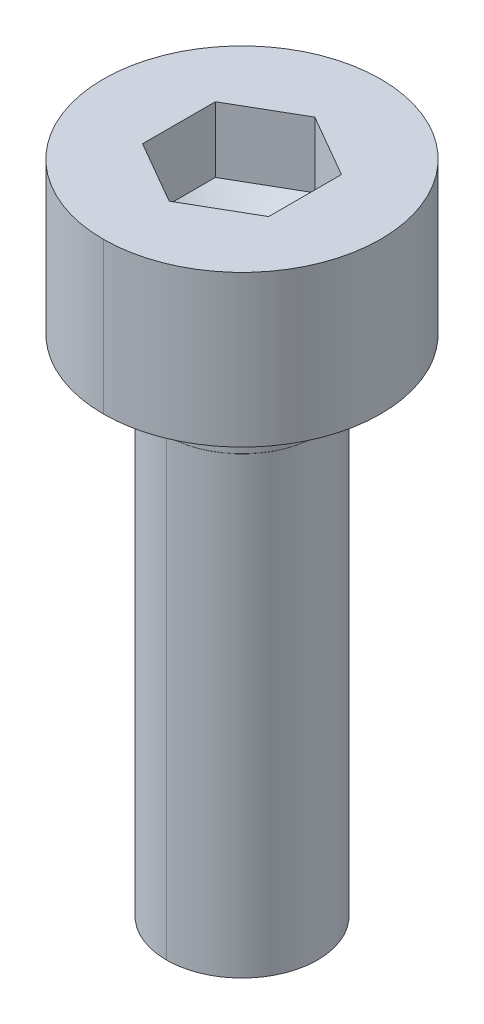
ISO-10303-21;
HEADER;
FILE_DESCRIPTION(('STEP AP214'),'2;1');
FILE_NAME('part.step','',(''),(''),'','','');
FILE_SCHEMA(('AUTOMOTIVE_DESIGN { 1 0 10303 214 1 1 1 1 }'));
ENDSEC;
DATA;
#1=APPLICATION_CONTEXT('core data for automotive mechanical design processes');
#2=APPLICATION_PROTOCOL_DEFINITION('international standard','automotive_design',2000,#1);
#3=PRODUCT_CONTEXT('',#1,'mechanical');
#4=PRODUCT('Part','Part','',(#3));
#5=PRODUCT_RELATED_PRODUCT_CATEGORY('part','',(#4));
#6=PRODUCT_DEFINITION_FORMATION('','',#4);
#7=PRODUCT_DEFINITION_CONTEXT('part definition',#1,'design');
#8=PRODUCT_DEFINITION('design','',#6,#7);
#9=PRODUCT_DEFINITION_SHAPE('','',#8);
#10=(LENGTH_UNIT() NAMED_UNIT(*) SI_UNIT(.MILLI.,.METRE.));
#11=(NAMED_UNIT(*) PLANE_ANGLE_UNIT() SI_UNIT($,.RADIAN.));
#12=(NAMED_UNIT(*) SI_UNIT($,.STERADIAN.) SOLID_ANGLE_UNIT());
#13=UNCERTAINTY_MEASURE_WITH_UNIT(LENGTH_MEASURE(1.E-05),#10,'distance_accuracy_value','');
#14=(GEOMETRIC_REPRESENTATION_CONTEXT(3) GLOBAL_UNCERTAINTY_ASSIGNED_CONTEXT((#13)) GLOBAL_UNIT_ASSIGNED_CONTEXT((#10,
#11,#12)) REPRESENTATION_CONTEXT('',''));
#15=CARTESIAN_POINT('',(0.,0.,0.));
#16=DIRECTION('',(0.,0.,1.));
#17=DIRECTION('',(1.,0.,0.));
#18=AXIS2_PLACEMENT_3D('',#15,#16,#17);
#19=CARTESIAN_POINT('',(32.0429399400243,1123.86666666666,18.5000000000011));
#20=DIRECTION('',(0.,1.,0.));
#21=DIRECTION('',(0.,0.,-1.));
#22=AXIS2_PLACEMENT_3D('',#19,#20,#21);
#23=CONICAL_SURFACE('',#22,1732.05080756898,1.04719755119662);
#24=DIRECTION('',(0.,0.499999999999978,0.866025403784451));
#25=VECTOR('',#24,1.);
#26=CARTESIAN_POINT('',(32.0429399400242,123.866666666664,18.5));
#27=LINE('',#26,#25);
#28=CARTESIAN_POINT('',(32.0429399400242,123.866666666664,18.5));
#29=VERTEX_POINT('',#28);
#30=CARTESIAN_POINT('',(32.0429399400241,124.699999999997,19.9433756729742));
#31=VERTEX_POINT('',#30);
#32=EDGE_CURVE('E136',#29,#31,#27,.T.);
#33=ORIENTED_EDGE('',*,*,#32,.F.);
#34=DIRECTION('',(0.,0.49999999999998,-0.86602540378445));
#35=VECTOR('',#34,1.);
#36=CARTESIAN_POINT('',(32.0429399400242,123.866666666664,18.5));
#37=LINE('',#36,#35);
#38=CARTESIAN_POINT('',(32.0429399400244,124.699999999997,17.0566243270259));
#39=VERTEX_POINT('',#38);
#40=EDGE_CURVE('E138',#29,#39,#37,.T.);
#41=ORIENTED_EDGE('',*,*,#40,.T.);
#42=CARTESIAN_POINT('',(32.0429399400242,124.699999999997,18.5));
#43=DIRECTION('',(0.,1.,0.));
#44=DIRECTION('',(0.,0.,1.));
#45=AXIS2_PLACEMENT_3D('',#42,#43,#44);
#46=CIRCLE('',#45,1.44337567297414);
#47=CARTESIAN_POINT('',(30.7929399400243,124.699999999997,17.7783121635129));
#48=VERTEX_POINT('',#47);
#49=EDGE_CURVE('E11',#39,#48,#46,.T.);
#50=ORIENTED_EDGE('',*,*,#49,.T.);
#51=CARTESIAN_POINT('',(32.0429399400242,124.699999999997,18.5));
#52=DIRECTION('',(0.,1.,0.));
#53=DIRECTION('',(0.,0.,1.));
#54=AXIS2_PLACEMENT_3D('',#51,#52,#53);
#55=CIRCLE('',#54,1.44337567297414);
#56=CARTESIAN_POINT('',(30.7929399400241,124.699999999997,19.221687836487));
#57=VERTEX_POINT('',#56);
#58=EDGE_CURVE('E25',#48,#57,#55,.T.);
#59=ORIENTED_EDGE('',*,*,#58,.T.);
#60=CARTESIAN_POINT('',(32.0429399400242,124.699999999997,18.5));
#61=DIRECTION('',(0.,1.,0.));
#62=DIRECTION('',(0.,0.,1.));
#63=AXIS2_PLACEMENT_3D('',#60,#61,#62);
#64=CIRCLE('',#63,1.44337567297414);
#65=EDGE_CURVE('E139',#57,#31,#64,.T.);
#66=ORIENTED_EDGE('',*,*,#65,.T.);
#67=EDGE_LOOP('',(#33,#41,#50,#59,#66));
#68=FACE_BOUND('',#67,.T.);
#69=ADVANCED_FACE('F17',(#68),#23,.F.);
#70=CARTESIAN_POINT('',(33.4863156129984,124.699999999997,18.5));
#71=DIRECTION('',(0.,1.,0.));
#72=DIRECTION('',(0.,0.,-1.));
#73=AXIS2_PLACEMENT_3D('',#70,#71,#72);
#74=PLANE('',#73);
#75=DIRECTION('',(0.,0.,1.));
#76=VECTOR('',#75,1.);
#77=CARTESIAN_POINT('',(33.2929399400242,124.699999999997,17.778312163513));
#78=LINE('',#77,#76);
#79=CARTESIAN_POINT('',(33.2929399400242,124.699999999997,17.778312163513));
#80=VERTEX_POINT('',#79);
#81=CARTESIAN_POINT('',(33.2929399400242,124.699999999997,19.2216878364873));
#82=VERTEX_POINT('',#81);
#83=EDGE_CURVE('E175',#80,#82,#78,.T.);
#84=ORIENTED_EDGE('',*,*,#83,.F.);
#85=CARTESIAN_POINT('',(32.0429399400242,124.699999999997,18.5));
#86=DIRECTION('',(0.,1.,0.));
#87=DIRECTION('',(0.,0.,1.));
#88=AXIS2_PLACEMENT_3D('',#85,#86,#87);
#89=CIRCLE('',#88,1.44337567297414);
#90=EDGE_CURVE('E172',#82,#80,#89,.T.);
#91=ORIENTED_EDGE('',*,*,#90,.F.);
#92=EDGE_LOOP('',(#84,#91));
#93=FACE_BOUND('',#92,.T.);
#94=ADVANCED_FACE('F317',(#93),#74,.F.);
#95=CARTESIAN_POINT('',(33.4863156129984,124.699999999997,18.5));
#96=DIRECTION('',(0.,1.,0.));
#97=DIRECTION('',(0.,0.,-1.));
#98=AXIS2_PLACEMENT_3D('',#95,#96,#97);
#99=PLANE('',#98);
#100=DIRECTION('',(0.866025403784439,0.,0.5));
#101=VECTOR('',#100,1.);
#102=CARTESIAN_POINT('',(32.0429399400242,124.699999999997,17.056624327026));
#103=LINE('',#102,#101);
#104=EDGE_CURVE('E295',#39,#80,#103,.T.);
#105=ORIENTED_EDGE('',*,*,#104,.F.);
#106=CARTESIAN_POINT('',(32.0429399400242,124.699999999997,18.5));
#107=DIRECTION('',(0.,1.,0.));
#108=DIRECTION('',(0.,0.,1.));
#109=AXIS2_PLACEMENT_3D('',#106,#107,#108);
#110=CIRCLE('',#109,1.44337567297414);
#111=EDGE_CURVE('E150',#80,#39,#110,.T.);
#112=ORIENTED_EDGE('',*,*,#111,.F.);
#113=EDGE_LOOP('',(#105,#112));
#114=FACE_BOUND('',#113,.T.);
#115=ADVANCED_FACE('F319',(#114),#99,.F.);
#116=CARTESIAN_POINT('',(33.4863156129984,124.699999999997,18.5));
#117=DIRECTION('',(0.,1.,0.));
#118=DIRECTION('',(0.,0.,-1.));
#119=AXIS2_PLACEMENT_3D('',#116,#117,#118);
#120=PLANE('',#119);
#121=DIRECTION('',(0.866025403784439,0.,-0.5));
#122=VECTOR('',#121,1.);
#123=CARTESIAN_POINT('',(30.7929399400243,124.699999999997,17.778312163513));
#124=LINE('',#123,#122);
#125=EDGE_CURVE('E287',#48,#39,#124,.T.);
#126=ORIENTED_EDGE('',*,*,#125,.F.);
#127=ORIENTED_EDGE('',*,*,#49,.F.);
#128=EDGE_LOOP('',(#126,#127));
#129=FACE_BOUND('',#128,.T.);
#130=ADVANCED_FACE('F326',(#129),#120,.F.);
#131=CARTESIAN_POINT('',(33.4863156129984,124.699999999997,18.5));
#132=DIRECTION('',(0.,1.,0.));
#133=DIRECTION('',(0.,0.,-1.));
#134=AXIS2_PLACEMENT_3D('',#131,#132,#133);
#135=PLANE('',#134);
#136=DIRECTION('',(0.,0.,-1.));
#137=VECTOR('',#136,1.);
#138=CARTESIAN_POINT('',(30.7929399400243,124.699999999997,19.221687836487));
#139=LINE('',#138,#137);
#140=EDGE_CURVE('E197',#57,#48,#139,.T.);
#141=ORIENTED_EDGE('',*,*,#140,.F.);
#142=ORIENTED_EDGE('',*,*,#58,.F.);
#143=EDGE_LOOP('',(#141,#142));
#144=FACE_BOUND('',#143,.T.);
#145=ADVANCED_FACE('F332',(#144),#135,.F.);
#146=CARTESIAN_POINT('',(33.4863156129984,124.699999999997,18.5));
#147=DIRECTION('',(0.,1.,0.));
#148=DIRECTION('',(0.,0.,-1.));
#149=AXIS2_PLACEMENT_3D('',#146,#147,#148);
#150=PLANE('',#149);
#151=DIRECTION('',(-0.866025403784439,0.,-0.5));
#152=VECTOR('',#151,1.);
#153=CARTESIAN_POINT('',(32.0429399400242,124.699999999997,19.9433756729741));
#154=LINE('',#153,#152);
#155=EDGE_CURVE('E218',#31,#57,#154,.T.);
#156=ORIENTED_EDGE('',*,*,#155,.F.);
#157=ORIENTED_EDGE('',*,*,#65,.F.);
#158=EDGE_LOOP('',(#156,#157));
#159=FACE_BOUND('',#158,.T.);
#160=ADVANCED_FACE('F336',(#159),#150,.F.);
#161=CARTESIAN_POINT('',(33.4863156129984,124.699999999997,18.5));
#162=DIRECTION('',(0.,1.,0.));
#163=DIRECTION('',(0.,0.,-1.));
#164=AXIS2_PLACEMENT_3D('',#161,#162,#163);
#165=PLANE('',#164);
#166=DIRECTION('',(-0.866025403784439,0.,0.5));
#167=VECTOR('',#166,1.);
#168=CARTESIAN_POINT('',(33.2929399400242,124.699999999997,19.221687836487));
#169=LINE('',#168,#167);
#170=EDGE_CURVE('E265',#82,#31,#169,.T.);
#171=ORIENTED_EDGE('',*,*,#170,.F.);
#172=CARTESIAN_POINT('',(32.0429399400242,124.699999999997,18.5));
#173=DIRECTION('',(0.,1.,0.));
#174=DIRECTION('',(0.,0.,1.));
#175=AXIS2_PLACEMENT_3D('',#172,#173,#174);
#176=CIRCLE('',#175,1.44337567297414);
#177=EDGE_CURVE('E144',#31,#82,#176,.T.);
#178=ORIENTED_EDGE('',*,*,#177,.F.);
#179=EDGE_LOOP('',(#171,#178));
#180=FACE_BOUND('',#179,.T.);
#181=ADVANCED_FACE('F316',(#180),#165,.F.);
#182=CARTESIAN_POINT('',(33.2929399400242,125.999999999997,17.778312163513));
#183=DIRECTION('',(-1.,0.,0.));
#184=DIRECTION('',(0.,0.,1.));
#185=AXIS2_PLACEMENT_3D('',#182,#183,#184);
#186=PLANE('',#185);
#187=ORIENTED_EDGE('',*,*,#83,.T.);
#188=DIRECTION('',(0.,-1.,0.));
#189=VECTOR('',#188,1.);
#190=CARTESIAN_POINT('',(33.2929399400242,125.999999999997,19.221687836487));
#191=LINE('',#190,#189);
#192=CARTESIAN_POINT('',(33.2929399400242,125.999999999997,19.221687836487));
#193=VERTEX_POINT('',#192);
#194=EDGE_CURVE('E222',#193,#82,#191,.T.);
#195=ORIENTED_EDGE('',*,*,#194,.F.);
#196=DIRECTION('',(0.,0.,1.));
#197=VECTOR('',#196,1.);
#198=CARTESIAN_POINT('',(33.2929399400242,125.999999999997,17.778312163513));
#199=LINE('',#198,#197);
#200=CARTESIAN_POINT('',(33.2929399400242,125.999999999997,17.778312163513));
#201=VERTEX_POINT('',#200);
#202=EDGE_CURVE('E254',#201,#193,#199,.T.);
#203=ORIENTED_EDGE('',*,*,#202,.F.);
#204=DIRECTION('',(0.,-1.,0.));
#205=VECTOR('',#204,1.);
#206=CARTESIAN_POINT('',(33.2929399400242,125.999999999997,17.778312163513));
#207=LINE('',#206,#205);
#208=EDGE_CURVE('E299',#201,#80,#207,.T.);
#209=ORIENTED_EDGE('',*,*,#208,.T.);
#210=EDGE_LOOP('',(#187,#195,#203,#209));
#211=FACE_BOUND('',#210,.T.);
#212=ADVANCED_FACE('F306',(#211),#186,.T.);
#213=CARTESIAN_POINT('',(32.0429399400242,125.999999999997,17.056624327026));
#214=DIRECTION('',(-0.5,0.,0.866025403784439));
#215=DIRECTION('',(0.,1.,0.));
#216=AXIS2_PLACEMENT_3D('',#213,#214,#215);
#217=PLANE('',#216);
#218=ORIENTED_EDGE('',*,*,#104,.T.);
#219=ORIENTED_EDGE('',*,*,#208,.F.);
#220=DIRECTION('',(0.866025403784439,0.,0.5));
#221=VECTOR('',#220,1.);
#222=CARTESIAN_POINT('',(32.0429399400242,125.999999999997,17.056624327026));
#223=LINE('',#222,#221);
#224=CARTESIAN_POINT('',(32.0429399400242,125.999999999997,17.056624327026));
#225=VERTEX_POINT('',#224);
#226=EDGE_CURVE('E250',#225,#201,#223,.T.);
#227=ORIENTED_EDGE('',*,*,#226,.F.);
#228=DIRECTION('',(0.,-1.,0.));
#229=VECTOR('',#228,1.);
#230=CARTESIAN_POINT('',(32.0429399400242,125.999999999997,17.056624327026));
#231=LINE('',#230,#229);
#232=EDGE_CURVE('E291',#225,#39,#231,.T.);
#233=ORIENTED_EDGE('',*,*,#232,.T.);
#234=EDGE_LOOP('',(#218,#219,#227,#233));
#235=FACE_BOUND('',#234,.T.);
#236=ADVANCED_FACE('F345',(#235),#217,.T.);
#237=CARTESIAN_POINT('',(30.7929399400243,125.999999999997,17.778312163513));
#238=DIRECTION('',(0.5,0.,0.866025403784439));
#239=DIRECTION('',(0.,-1.,0.));
#240=AXIS2_PLACEMENT_3D('',#237,#238,#239);
#241=PLANE('',#240);
#242=ORIENTED_EDGE('',*,*,#125,.T.);
#243=ORIENTED_EDGE('',*,*,#232,.F.);
#244=DIRECTION('',(0.866025403784439,0.,-0.5));
#245=VECTOR('',#244,1.);
#246=CARTESIAN_POINT('',(30.7929399400243,125.999999999997,17.778312163513));
#247=LINE('',#246,#245);
#248=CARTESIAN_POINT('',(30.7929399400243,125.999999999997,17.778312163513));
#249=VERTEX_POINT('',#248);
#250=EDGE_CURVE('E242',#249,#225,#247,.T.);
#251=ORIENTED_EDGE('',*,*,#250,.F.);
#252=DIRECTION('',(0.,-1.,0.));
#253=VECTOR('',#252,1.);
#254=CARTESIAN_POINT('',(30.7929399400243,125.999999999997,17.778312163513));
#255=LINE('',#254,#253);
#256=EDGE_CURVE('E201',#249,#48,#255,.T.);
#257=ORIENTED_EDGE('',*,*,#256,.T.);
#258=EDGE_LOOP('',(#242,#243,#251,#257));
#259=FACE_BOUND('',#258,.T.);
#260=ADVANCED_FACE('F350',(#259),#241,.T.);
#261=CARTESIAN_POINT('',(30.7929399400243,125.999999999997,19.221687836487));
#262=DIRECTION('',(1.,0.,0.));
#263=DIRECTION('',(0.,0.,1.));
#264=AXIS2_PLACEMENT_3D('',#261,#262,#263);
#265=PLANE('',#264);
#266=ORIENTED_EDGE('',*,*,#140,.T.);
#267=ORIENTED_EDGE('',*,*,#256,.F.);
#268=DIRECTION('',(0.,0.,-1.));
#269=VECTOR('',#268,1.);
#270=CARTESIAN_POINT('',(30.7929399400243,125.999999999997,19.221687836487));
#271=LINE('',#270,#269);
#272=CARTESIAN_POINT('',(30.7929399400243,125.999999999997,19.221687836487));
#273=VERTEX_POINT('',#272);
#274=EDGE_CURVE('E238',#273,#249,#271,.T.);
#275=ORIENTED_EDGE('',*,*,#274,.F.);
#276=DIRECTION('',(0.,-1.,0.));
#277=VECTOR('',#276,1.);
#278=CARTESIAN_POINT('',(30.7929399400243,125.999999999997,19.221687836487));
#279=LINE('',#278,#277);
#280=EDGE_CURVE('E202',#273,#57,#279,.T.);
#281=ORIENTED_EDGE('',*,*,#280,.T.);
#282=EDGE_LOOP('',(#266,#267,#275,#281));
#283=FACE_BOUND('',#282,.T.);
#284=ADVANCED_FACE('F346',(#283),#265,.T.);
#285=CARTESIAN_POINT('',(32.0429399400242,125.999999999997,19.9433756729741));
#286=DIRECTION('',(0.5,0.,-0.866025403784439));
#287=DIRECTION('',(0.,-1.,0.));
#288=AXIS2_PLACEMENT_3D('',#285,#286,#287);
#289=PLANE('',#288);
#290=ORIENTED_EDGE('',*,*,#155,.T.);
#291=ORIENTED_EDGE('',*,*,#280,.F.);
#292=DIRECTION('',(-0.866025403784439,0.,-0.5));
#293=VECTOR('',#292,1.);
#294=CARTESIAN_POINT('',(32.0429399400242,125.999999999997,19.9433756729741));
#295=LINE('',#294,#293);
#296=CARTESIAN_POINT('',(32.0429399400242,125.999999999997,19.9433756729741));
#297=VERTEX_POINT('',#296);
#298=EDGE_CURVE('E229',#297,#273,#295,.T.);
#299=ORIENTED_EDGE('',*,*,#298,.F.);
#300=DIRECTION('',(0.,-1.,0.));
#301=VECTOR('',#300,1.);
#302=CARTESIAN_POINT('',(32.0429399400242,125.999999999997,19.9433756729741));
#303=LINE('',#302,#301);
#304=EDGE_CURVE('E246',#297,#31,#303,.T.);
#305=ORIENTED_EDGE('',*,*,#304,.T.);
#306=EDGE_LOOP('',(#290,#291,#299,#305));
#307=FACE_BOUND('',#306,.T.);
#308=ADVANCED_FACE('F349',(#307),#289,.T.);
#309=CARTESIAN_POINT('',(33.2929399400242,125.999999999997,19.221687836487));
#310=DIRECTION('',(-0.5,0.,-0.866025403784439));
#311=DIRECTION('',(-0.866025403784439,0.,0.5));
#312=AXIS2_PLACEMENT_3D('',#309,#310,#311);
#313=PLANE('',#312);
#314=ORIENTED_EDGE('',*,*,#170,.T.);
#315=ORIENTED_EDGE('',*,*,#304,.F.);
#316=DIRECTION('',(-0.866025403784439,0.,0.5));
#317=VECTOR('',#316,1.);
#318=CARTESIAN_POINT('',(33.2929399400242,125.999999999997,19.221687836487));
#319=LINE('',#318,#317);
#320=EDGE_CURVE('E258',#193,#297,#319,.T.);
#321=ORIENTED_EDGE('',*,*,#320,.F.);
#322=ORIENTED_EDGE('',*,*,#194,.T.);
#323=EDGE_LOOP('',(#314,#315,#321,#322));
#324=FACE_BOUND('',#323,.T.);
#325=ADVANCED_FACE('F313',(#324),#313,.T.);
#326=CARTESIAN_POINT('',(32.0429399400242,122.999999999997,18.5));
#327=DIRECTION('',(0.,-1.,0.));
#328=DIRECTION('',(0.,0.,1.));
#329=AXIS2_PLACEMENT_3D('',#326,#327,#328);
#330=CYLINDRICAL_SURFACE('',#329,2.74999999999981);
#331=DIRECTION('',(0.,-1.,0.));
#332=VECTOR('',#331,1.);
#333=CARTESIAN_POINT('',(32.0429399400242,122.999999999997,15.75));
#334=LINE('',#333,#332);
#335=CARTESIAN_POINT('',(32.0429399400242,125.999999999997,15.75));
#336=VERTEX_POINT('',#335);
#337=CARTESIAN_POINT('',(32.0429399400242,122.999999999997,15.75));
#338=VERTEX_POINT('',#337);
#339=EDGE_CURVE('E186',#336,#338,#334,.T.);
#340=ORIENTED_EDGE('',*,*,#339,.F.);
#341=CARTESIAN_POINT('',(32.0429399400242,125.999999999997,18.5));
#342=DIRECTION('',(0.,1.,0.));
#343=DIRECTION('',(0.,0.,1.));
#344=AXIS2_PLACEMENT_3D('',#341,#342,#343);
#345=CIRCLE('',#344,2.74999999999981);
#346=CARTESIAN_POINT('',(32.0429399400242,125.999999999997,21.25));
#347=VERTEX_POINT('',#346);
#348=EDGE_CURVE('E226',#347,#336,#345,.T.);
#349=ORIENTED_EDGE('',*,*,#348,.F.);
#350=DIRECTION('',(0.,-1.,0.));
#351=VECTOR('',#350,1.);
#352=CARTESIAN_POINT('',(32.0429399400242,122.999999999997,21.25));
#353=LINE('',#352,#351);
#354=CARTESIAN_POINT('',(32.0429399400242,122.999999999997,21.25));
#355=VERTEX_POINT('',#354);
#356=EDGE_CURVE('E162',#347,#355,#353,.T.);
#357=ORIENTED_EDGE('',*,*,#356,.T.);
#358=CARTESIAN_POINT('',(32.0429399400242,122.999999999997,18.5));
#359=DIRECTION('',(0.,1.,0.));
#360=DIRECTION('',(0.,0.,1.));
#361=AXIS2_PLACEMENT_3D('',#358,#359,#360);
#362=CIRCLE('',#361,2.74999999999981);
#363=EDGE_CURVE('E233',#355,#338,#362,.T.);
#364=ORIENTED_EDGE('',*,*,#363,.T.);
#365=EDGE_LOOP('',(#340,#349,#357,#364));
#366=FACE_BOUND('',#365,.T.);
#367=ADVANCED_FACE('F352',(#366),#330,.T.);
#368=CARTESIAN_POINT('',(32.0429399400242,122.999999999997,18.5));
#369=DIRECTION('',(0.,-1.,0.));
#370=DIRECTION('',(0.,0.,-1.));
#371=AXIS2_PLACEMENT_3D('',#368,#369,#370);
#372=PLANE('',#371);
#373=CARTESIAN_POINT('',(32.0429399400242,122.999999999997,18.5));
#374=DIRECTION('',(0.,1.,0.));
#375=DIRECTION('',(0.,0.,1.));
#376=AXIS2_PLACEMENT_3D('',#373,#374,#375);
#377=CIRCLE('',#376,1.49750000000015);
#378=CARTESIAN_POINT('',(32.0429399400242,122.999999999997,19.9975));
#379=VERTEX_POINT('',#378);
#380=CARTESIAN_POINT('',(32.0429399400242,122.999999999997,17.0025));
#381=VERTEX_POINT('',#380);
#382=EDGE_CURVE('E230',#379,#381,#377,.T.);
#383=ORIENTED_EDGE('',*,*,#382,.T.);
#384=CARTESIAN_POINT('',(32.0429399400242,122.999999999997,18.5));
#385=DIRECTION('',(0.,1.,0.));
#386=DIRECTION('',(0.,0.,1.));
#387=AXIS2_PLACEMENT_3D('',#384,#385,#386);
#388=CIRCLE('',#387,1.49750000000015);
#389=EDGE_CURVE('E157',#381,#379,#388,.T.);
#390=ORIENTED_EDGE('',*,*,#389,.T.);
#391=EDGE_LOOP('',(#383,#390));
#392=FACE_BOUND('',#391,.T.);
#393=ORIENTED_EDGE('',*,*,#363,.F.);
#394=CARTESIAN_POINT('',(32.0429399400242,122.999999999997,18.5));
#395=DIRECTION('',(0.,1.,0.));
#396=DIRECTION('',(0.,0.,1.));
#397=AXIS2_PLACEMENT_3D('',#394,#395,#396);
#398=CIRCLE('',#397,2.74999999999981);
#399=EDGE_CURVE('E190',#338,#355,#398,.T.);
#400=ORIENTED_EDGE('',*,*,#399,.F.);
#401=EDGE_LOOP('',(#393,#400));
#402=FACE_BOUND('',#401,.T.);
#403=ADVANCED_FACE('F355',(#392,#402),#372,.T.);
#404=CARTESIAN_POINT('',(32.0429399400242,122.999999999997,18.5));
#405=DIRECTION('',(0.,-1.,0.));
#406=DIRECTION('',(0.,0.,1.));
#407=AXIS2_PLACEMENT_3D('',#404,#405,#406);
#408=CYLINDRICAL_SURFACE('',#407,1.49750000000015);
#409=DIRECTION('',(0.,-1.,0.));
#410=VECTOR('',#409,1.);
#411=CARTESIAN_POINT('',(32.0429399400242,122.999999999997,17.0025));
#412=LINE('',#411,#410);
#413=CARTESIAN_POINT('',(32.0429399400242,121.999999999997,17.0025));
#414=VERTEX_POINT('',#413);
#415=EDGE_CURVE('E161',#381,#414,#412,.T.);
#416=ORIENTED_EDGE('',*,*,#415,.F.);
#417=ORIENTED_EDGE('',*,*,#382,.F.);
#418=DIRECTION('',(0.,-1.,0.));
#419=VECTOR('',#418,1.);
#420=CARTESIAN_POINT('',(32.0429399400242,122.999999999997,19.9975));
#421=LINE('',#420,#419);
#422=CARTESIAN_POINT('',(32.0429399400242,121.999999999997,19.9975));
#423=VERTEX_POINT('',#422);
#424=EDGE_CURVE('E163',#379,#423,#421,.T.);
#425=ORIENTED_EDGE('',*,*,#424,.T.);
#426=CARTESIAN_POINT('',(32.0429399400242,121.999999999997,18.5));
#427=DIRECTION('',(0.,1.,0.));
#428=DIRECTION('',(0.,0.,1.));
#429=AXIS2_PLACEMENT_3D('',#426,#427,#428);
#430=CIRCLE('',#429,1.49750000000015);
#431=EDGE_CURVE('E234',#423,#414,#430,.T.);
#432=ORIENTED_EDGE('',*,*,#431,.T.);
#433=EDGE_LOOP('',(#416,#417,#425,#432));
#434=FACE_BOUND('',#433,.T.);
#435=ADVANCED_FACE('F359',(#434),#408,.T.);
#436=CARTESIAN_POINT('',(33.5429399400243,121.999999999997,18.5));
#437=DIRECTION('',(0.,1.,0.));
#438=DIRECTION('',(0.,0.,-1.));
#439=AXIS2_PLACEMENT_3D('',#436,#437,#438);
#440=PLANE('',#439);
#441=ORIENTED_EDGE('',*,*,#431,.F.);
#442=CARTESIAN_POINT('',(32.0429399400242,121.999999999997,18.5));
#443=DIRECTION('',(0.,1.,0.));
#444=DIRECTION('',(0.,0.,1.));
#445=AXIS2_PLACEMENT_3D('',#442,#443,#444);
#446=CIRCLE('',#445,1.49750000000015);
#447=EDGE_CURVE('E167',#414,#423,#446,.T.);
#448=ORIENTED_EDGE('',*,*,#447,.F.);
#449=EDGE_LOOP('',(#441,#448));
#450=FACE_BOUND('',#449,.T.);
#451=CARTESIAN_POINT('',(32.0429399400242,121.999999999997,18.5));
#452=DIRECTION('',(0.,1.,0.));
#453=DIRECTION('',(0.,0.,1.));
#454=AXIS2_PLACEMENT_3D('',#451,#452,#453);
#455=CIRCLE('',#454,1.50000000000006);
#456=CARTESIAN_POINT('',(32.0429399400242,121.999999999997,20.));
#457=VERTEX_POINT('',#456);
#458=CARTESIAN_POINT('',(32.0429399400242,121.999999999997,17.));
#459=VERTEX_POINT('',#458);
#460=EDGE_CURVE('E268',#457,#459,#455,.T.);
#461=ORIENTED_EDGE('',*,*,#460,.T.);
#462=CARTESIAN_POINT('',(32.0429399400242,121.999999999997,18.5));
#463=DIRECTION('',(0.,1.,0.));
#464=DIRECTION('',(0.,0.,1.));
#465=AXIS2_PLACEMENT_3D('',#462,#463,#464);
#466=CIRCLE('',#465,1.50000000000006);
#467=EDGE_CURVE('E166',#459,#457,#466,.T.);
#468=ORIENTED_EDGE('',*,*,#467,.T.);
#469=EDGE_LOOP('',(#461,#468));
#470=FACE_BOUND('',#469,.T.);
#471=ADVANCED_FACE('F363',(#450,#470),#440,.T.);
#472=CARTESIAN_POINT('',(32.0429399400242,122.999999999997,18.5));
#473=DIRECTION('',(0.,-1.,0.));
#474=DIRECTION('',(0.,0.,1.));
#475=AXIS2_PLACEMENT_3D('',#472,#473,#474);
#476=CYLINDRICAL_SURFACE('',#475,1.50000000000006);
#477=DIRECTION('',(0.,-1.,0.));
#478=VECTOR('',#477,1.);
#479=CARTESIAN_POINT('',(32.0429399400242,122.999999999997,17.));
#480=LINE('',#479,#478);
#481=CARTESIAN_POINT('',(32.0429399400242,112.999999999997,17.));
#482=VERTEX_POINT('',#481);
#483=EDGE_CURVE('E206',#459,#482,#480,.T.);
#484=ORIENTED_EDGE('',*,*,#483,.F.);
#485=ORIENTED_EDGE('',*,*,#460,.F.);
#486=DIRECTION('',(0.,-1.,0.));
#487=VECTOR('',#486,1.);
#488=CARTESIAN_POINT('',(32.0429399400242,122.999999999997,20.));
#489=LINE('',#488,#487);
#490=CARTESIAN_POINT('',(32.0429399400242,112.999999999997,20.));
#491=VERTEX_POINT('',#490);
#492=EDGE_CURVE('E217',#457,#491,#489,.T.);
#493=ORIENTED_EDGE('',*,*,#492,.T.);
#494=CARTESIAN_POINT('',(32.0429399400242,112.999999999997,18.5));
#495=DIRECTION('',(0.,1.,0.));
#496=DIRECTION('',(0.,0.,1.));
#497=AXIS2_PLACEMENT_3D('',#494,#495,#496);
#498=CIRCLE('',#497,1.50000000000006);
#499=EDGE_CURVE('E262',#491,#482,#498,.T.);
#500=ORIENTED_EDGE('',*,*,#499,.T.);
#501=EDGE_LOOP('',(#484,#485,#493,#500));
#502=FACE_BOUND('',#501,.T.);
#503=ADVANCED_FACE('F375',(#502),#476,.T.);
#504=CARTESIAN_POINT('',(32.0429399400242,112.999999999997,18.5));
#505=DIRECTION('',(0.,-1.,0.));
#506=DIRECTION('',(0.,0.,-1.));
#507=AXIS2_PLACEMENT_3D('',#504,#505,#506);
#508=PLANE('',#507);
#509=ORIENTED_EDGE('',*,*,#499,.F.);
#510=CARTESIAN_POINT('',(32.0429399400242,112.999999999997,18.5));
#511=DIRECTION('',(0.,1.,0.));
#512=DIRECTION('',(0.,0.,1.));
#513=AXIS2_PLACEMENT_3D('',#510,#511,#512);
#514=CIRCLE('',#513,1.50000000000006);
#515=EDGE_CURVE('E213',#482,#491,#514,.T.);
#516=ORIENTED_EDGE('',*,*,#515,.F.);
#517=EDGE_LOOP('',(#509,#516));
#518=FACE_BOUND('',#517,.T.);
#519=ADVANCED_FACE('F371',(#518),#508,.T.);
#520=CARTESIAN_POINT('',(34.792939940024,125.999999999997,18.5));
#521=DIRECTION('',(0.,1.,0.));
#522=DIRECTION('',(0.,0.,-1.));
#523=AXIS2_PLACEMENT_3D('',#520,#521,#522);
#524=PLANE('',#523);
#525=ORIENTED_EDGE('',*,*,#298,.T.);
#526=ORIENTED_EDGE('',*,*,#274,.T.);
#527=ORIENTED_EDGE('',*,*,#250,.T.);
#528=ORIENTED_EDGE('',*,*,#226,.T.);
#529=ORIENTED_EDGE('',*,*,#202,.T.);
#530=ORIENTED_EDGE('',*,*,#320,.T.);
#531=EDGE_LOOP('',(#525,#526,#527,#528,#529,#530));
#532=FACE_BOUND('',#531,.T.);
#533=ORIENTED_EDGE('',*,*,#348,.T.);
#534=CARTESIAN_POINT('',(32.0429399400242,125.999999999997,18.5));
#535=DIRECTION('',(0.,1.,0.));
#536=DIRECTION('',(0.,0.,1.));
#537=AXIS2_PLACEMENT_3D('',#534,#535,#536);
#538=CIRCLE('',#537,2.74999999999981);
#539=EDGE_CURVE('E171',#336,#347,#538,.T.);
#540=ORIENTED_EDGE('',*,*,#539,.T.);
#541=EDGE_LOOP('',(#533,#540));
#542=FACE_BOUND('',#541,.T.);
#543=ADVANCED_FACE('F374',(#532,#542),#524,.T.);
#544=CARTESIAN_POINT('',(32.0429399400242,122.999999999997,18.5));
#545=DIRECTION('',(0.,-1.,0.));
#546=DIRECTION('',(0.,0.,1.));
#547=AXIS2_PLACEMENT_3D('',#544,#545,#546);
#548=CYLINDRICAL_SURFACE('',#547,1.50000000000006);
#549=ORIENTED_EDGE('',*,*,#467,.F.);
#550=ORIENTED_EDGE('',*,*,#483,.T.);
#551=ORIENTED_EDGE('',*,*,#515,.T.);
#552=ORIENTED_EDGE('',*,*,#492,.F.);
#553=EDGE_LOOP('',(#549,#550,#551,#552));
#554=FACE_BOUND('',#553,.T.);
#555=ADVANCED_FACE('F379',(#554),#548,.T.);
#556=CARTESIAN_POINT('',(32.0429399400242,122.999999999997,18.5));
#557=DIRECTION('',(0.,-1.,0.));
#558=DIRECTION('',(0.,0.,1.));
#559=AXIS2_PLACEMENT_3D('',#556,#557,#558);
#560=CYLINDRICAL_SURFACE('',#559,1.49750000000015);
#561=ORIENTED_EDGE('',*,*,#389,.F.);
#562=ORIENTED_EDGE('',*,*,#415,.T.);
#563=ORIENTED_EDGE('',*,*,#447,.T.);
#564=ORIENTED_EDGE('',*,*,#424,.F.);
#565=EDGE_LOOP('',(#561,#562,#563,#564));
#566=FACE_BOUND('',#565,.T.);
#567=ADVANCED_FACE('F385',(#566),#560,.T.);
#568=CARTESIAN_POINT('',(32.0429399400242,122.999999999997,18.5));
#569=DIRECTION('',(0.,-1.,0.));
#570=DIRECTION('',(0.,0.,1.));
#571=AXIS2_PLACEMENT_3D('',#568,#569,#570);
#572=CYLINDRICAL_SURFACE('',#571,2.74999999999981);
#573=ORIENTED_EDGE('',*,*,#539,.F.);
#574=ORIENTED_EDGE('',*,*,#339,.T.);
#575=ORIENTED_EDGE('',*,*,#399,.T.);
#576=ORIENTED_EDGE('',*,*,#356,.F.);
#577=EDGE_LOOP('',(#573,#574,#575,#576));
#578=FACE_BOUND('',#577,.T.);
#579=ADVANCED_FACE('F389',(#578),#572,.T.);
#580=CARTESIAN_POINT('',(32.0429399400243,1123.86666666666,18.5000000000011));
#581=DIRECTION('',(0.,1.,0.));
#582=DIRECTION('',(0.,0.,-1.));
#583=AXIS2_PLACEMENT_3D('',#580,#581,#582);
#584=CONICAL_SURFACE('',#583,1732.05080756898,1.04719755119662);
#585=ORIENTED_EDGE('',*,*,#40,.F.);
#586=ORIENTED_EDGE('',*,*,#32,.T.);
#587=ORIENTED_EDGE('',*,*,#177,.T.);
#588=ORIENTED_EDGE('',*,*,#90,.T.);
#589=ORIENTED_EDGE('',*,*,#111,.T.);
#590=EDGE_LOOP('',(#585,#586,#587,#588,#589));
#591=FACE_BOUND('',#590,.T.);
#592=ADVANCED_FACE('F147',(#591),#584,.F.);
#593=CLOSED_SHELL('',(#69,#94,#115,#130,#145,#160,#181,#212,#236,#260,#284,#308,#325,#367,#403,
#435,#471,#503,#519,#543,#555,#567,#579,#592));
#594=MANIFOLD_SOLID_BREP('B1',#593);
#595=ADVANCED_BREP_SHAPE_REPRESENTATION('',(#18,#594),#14);
#596=SHAPE_DEFINITION_REPRESENTATION(#9,#595);
ENDSEC;
END-ISO-10303-21;
